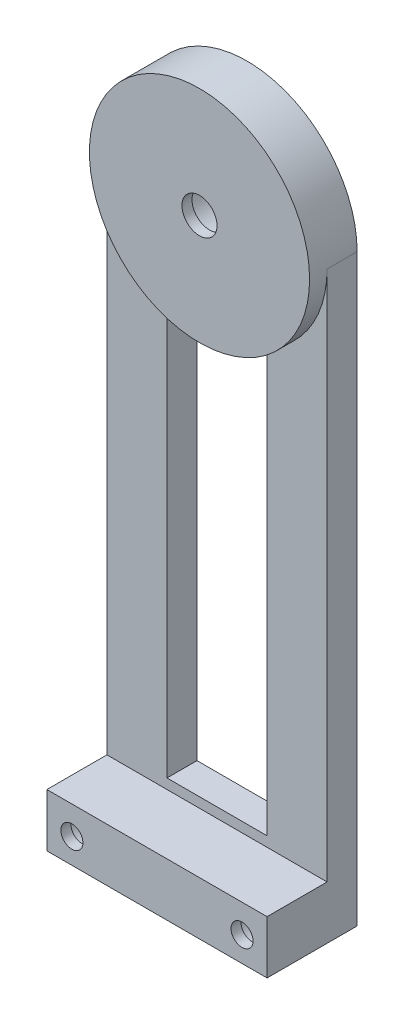
ISO-10303-21;
HEADER;
FILE_DESCRIPTION(('STEP AP214'),'2;1');
FILE_NAME('part.step','',(''),(''),'','','');
FILE_SCHEMA(('AUTOMOTIVE_DESIGN { 1 0 10303 214 1 1 1 1 }'));
ENDSEC;
DATA;
#1=APPLICATION_CONTEXT('core data for automotive mechanical design processes');
#2=APPLICATION_PROTOCOL_DEFINITION('international standard','automotive_design',2000,#1);
#3=PRODUCT_CONTEXT('',#1,'mechanical');
#4=PRODUCT('Part','Part','',(#3));
#5=PRODUCT_RELATED_PRODUCT_CATEGORY('part','',(#4));
#6=PRODUCT_DEFINITION_FORMATION('','',#4);
#7=PRODUCT_DEFINITION_CONTEXT('part definition',#1,'design');
#8=PRODUCT_DEFINITION('design','',#6,#7);
#9=PRODUCT_DEFINITION_SHAPE('','',#8);
#10=(LENGTH_UNIT() NAMED_UNIT(*) SI_UNIT(.MILLI.,.METRE.));
#11=(NAMED_UNIT(*) PLANE_ANGLE_UNIT() SI_UNIT($,.RADIAN.));
#12=(NAMED_UNIT(*) SI_UNIT($,.STERADIAN.) SOLID_ANGLE_UNIT());
#13=UNCERTAINTY_MEASURE_WITH_UNIT(LENGTH_MEASURE(1.E-05),#10,'distance_accuracy_value','');
#14=(GEOMETRIC_REPRESENTATION_CONTEXT(3) GLOBAL_UNCERTAINTY_ASSIGNED_CONTEXT((#13)) GLOBAL_UNIT_ASSIGNED_CONTEXT((#10,
#11,#12)) REPRESENTATION_CONTEXT('',''));
#15=CARTESIAN_POINT('',(0.,0.,0.));
#16=DIRECTION('',(0.,0.,1.));
#17=DIRECTION('',(1.,0.,0.));
#18=AXIS2_PLACEMENT_3D('',#15,#16,#17);
#19=CARTESIAN_POINT('',(8.5,-26.67999607,9.11126983722081));
#20=DIRECTION('',(0.,0.,-1.));
#21=DIRECTION('',(1.,0.,0.));
#22=AXIS2_PLACEMENT_3D('',#19,#20,#21);
#23=CYLINDRICAL_SURFACE('',#22,1.1);
#24=CARTESIAN_POINT('',(8.5,-26.67999607,6.));
#25=DIRECTION('',(0.,0.,1.));
#26=DIRECTION('',(1.,0.,0.));
#27=AXIS2_PLACEMENT_3D('',#24,#25,#26);
#28=CIRCLE('',#27,1.1);
#29=CARTESIAN_POINT('',(9.6,-26.67999607,6.));
#30=VERTEX_POINT('',#29);
#31=EDGE_CURVE('E256',#30,#30,#28,.F.);
#32=ORIENTED_EDGE('',*,*,#31,.F.);
#33=EDGE_LOOP('',(#32));
#34=FACE_BOUND('',#33,.T.);
#35=CARTESIAN_POINT('',(8.5,-26.67999607,5.));
#36=DIRECTION('',(0.,0.,1.));
#37=DIRECTION('',(1.,0.,0.));
#38=AXIS2_PLACEMENT_3D('',#35,#36,#37);
#39=CIRCLE('',#38,1.1);
#40=CARTESIAN_POINT('',(9.6,-26.67999607,5.));
#41=VERTEX_POINT('',#40);
#42=EDGE_CURVE('E262',#41,#41,#39,.F.);
#43=ORIENTED_EDGE('',*,*,#42,.T.);
#44=EDGE_LOOP('',(#43));
#45=FACE_BOUND('',#44,.T.);
#46=ADVANCED_FACE('F61',(#34,#45),#23,.F.);
#47=CARTESIAN_POINT('',(-8.5,-26.67999607,9.11126983722081));
#48=DIRECTION('',(0.,0.,-1.));
#49=DIRECTION('',(1.,0.,0.));
#50=AXIS2_PLACEMENT_3D('',#47,#48,#49);
#51=CYLINDRICAL_SURFACE('',#50,1.1);
#52=CARTESIAN_POINT('',(-8.5,-26.67999607,6.));
#53=DIRECTION('',(0.,0.,1.));
#54=DIRECTION('',(1.,0.,0.));
#55=AXIS2_PLACEMENT_3D('',#52,#53,#54);
#56=CIRCLE('',#55,1.1);
#57=CARTESIAN_POINT('',(-7.4,-26.67999607,6.));
#58=VERTEX_POINT('',#57);
#59=EDGE_CURVE('E208',#58,#58,#56,.F.);
#60=ORIENTED_EDGE('',*,*,#59,.F.);
#61=EDGE_LOOP('',(#60));
#62=FACE_BOUND('',#61,.T.);
#63=CARTESIAN_POINT('',(-8.5,-26.67999607,5.));
#64=DIRECTION('',(0.,0.,1.));
#65=DIRECTION('',(1.,0.,0.));
#66=AXIS2_PLACEMENT_3D('',#63,#64,#65);
#67=CIRCLE('',#66,1.1);
#68=CARTESIAN_POINT('',(-7.4,-26.67999607,5.));
#69=VERTEX_POINT('',#68);
#70=EDGE_CURVE('E259',#69,#69,#67,.F.);
#71=ORIENTED_EDGE('',*,*,#70,.T.);
#72=EDGE_LOOP('',(#71));
#73=FACE_BOUND('',#72,.T.);
#74=ADVANCED_FACE('F314',(#62,#73),#51,.F.);
#75=CARTESIAN_POINT('',(0.,0.,0.));
#76=DIRECTION('',(0.,0.,-1.));
#77=DIRECTION('',(1.,0.,0.));
#78=AXIS2_PLACEMENT_3D('',#75,#76,#77);
#79=PLANE('',#78);
#80=CARTESIAN_POINT('',(0.,29.175,0.));
#81=DIRECTION('',(0.,0.,1.));
#82=DIRECTION('',(1.,0.,0.));
#83=AXIS2_PLACEMENT_3D('',#80,#81,#82);
#84=CIRCLE('',#83,11.5);
#85=CARTESIAN_POINT('',(-5.,18.818842411396,0.));
#86=VERTEX_POINT('',#85);
#87=CARTESIAN_POINT('',(5.,18.818842411396,0.));
#88=VERTEX_POINT('',#87);
#89=EDGE_CURVE('E158',#86,#88,#84,.T.);
#90=ORIENTED_EDGE('',*,*,#89,.T.);
#91=DIRECTION('',(0.,-1.,0.));
#92=VECTOR('',#91,1.);
#93=CARTESIAN_POINT('',(5.,0.,0.));
#94=LINE('',#93,#92);
#95=CARTESIAN_POINT('',(5.00000000000001,-22.865,0.));
#96=VERTEX_POINT('',#95);
#97=EDGE_CURVE('E176',#88,#96,#94,.T.);
#98=ORIENTED_EDGE('',*,*,#97,.T.);
#99=DIRECTION('',(1.,0.,0.));
#100=VECTOR('',#99,1.);
#101=CARTESIAN_POINT('',(0.,-22.865,0.));
#102=LINE('',#101,#100);
#103=CARTESIAN_POINT('',(-5.,-22.865,0.));
#104=VERTEX_POINT('',#103);
#105=EDGE_CURVE('E230',#104,#96,#102,.T.);
#106=ORIENTED_EDGE('',*,*,#105,.F.);
#107=DIRECTION('',(0.,-1.,0.));
#108=VECTOR('',#107,1.);
#109=CARTESIAN_POINT('',(-5.,0.,0.));
#110=LINE('',#109,#108);
#111=EDGE_CURVE('E233',#86,#104,#110,.T.);
#112=ORIENTED_EDGE('',*,*,#111,.F.);
#113=EDGE_LOOP('',(#90,#98,#106,#112));
#114=FACE_BOUND('',#113,.T.);
#115=DIRECTION('',(1.,0.,0.));
#116=VECTOR('',#115,1.);
#117=CARTESIAN_POINT('',(0.,-23.865,0.));
#118=LINE('',#117,#116);
#119=CARTESIAN_POINT('',(-11.,-23.865,0.));
#120=VERTEX_POINT('',#119);
#121=CARTESIAN_POINT('',(11.,-23.865,0.));
#122=VERTEX_POINT('',#121);
#123=EDGE_CURVE('E204',#120,#122,#118,.T.);
#124=ORIENTED_EDGE('',*,*,#123,.T.);
#125=DIRECTION('',(0.,-1.,0.));
#126=VECTOR('',#125,1.);
#127=CARTESIAN_POINT('',(11.,0.,0.));
#128=LINE('',#127,#126);
#129=CARTESIAN_POINT('',(11.,29.175,0.));
#130=VERTEX_POINT('',#129);
#131=EDGE_CURVE('E235',#130,#122,#128,.T.);
#132=ORIENTED_EDGE('',*,*,#131,.F.);
#133=CARTESIAN_POINT('',(0.,29.175,0.));
#134=DIRECTION('',(0.,0.,1.));
#135=DIRECTION('',(1.,0.,0.));
#136=AXIS2_PLACEMENT_3D('',#133,#134,#135);
#137=CIRCLE('',#136,11.);
#138=CARTESIAN_POINT('',(-11.,29.175,0.));
#139=VERTEX_POINT('',#138);
#140=EDGE_CURVE('E13',#139,#130,#137,.T.);
#141=ORIENTED_EDGE('',*,*,#140,.F.);
#142=DIRECTION('',(0.,-1.,0.));
#143=VECTOR('',#142,1.);
#144=CARTESIAN_POINT('',(-11.,0.,0.));
#145=LINE('',#144,#143);
#146=EDGE_CURVE('E153',#139,#120,#145,.T.);
#147=ORIENTED_EDGE('',*,*,#146,.T.);
#148=EDGE_LOOP('',(#124,#132,#141,#147));
#149=FACE_BOUND('',#148,.T.);
#150=ADVANCED_FACE('F244',(#114,#149),#79,.F.);
#151=CARTESIAN_POINT('',(0.,29.175,6.69974746830584));
#152=DIRECTION('',(0.,0.,-1.));
#153=DIRECTION('',(1.,0.,0.));
#154=AXIS2_PLACEMENT_3D('',#151,#152,#153);
#155=CYLINDRICAL_SURFACE('',#154,1.75);
#156=CARTESIAN_POINT('',(0.,29.175,1.75));
#157=DIRECTION('',(0.,0.,1.));
#158=DIRECTION('',(1.,0.,0.));
#159=AXIS2_PLACEMENT_3D('',#156,#157,#158);
#160=CIRCLE('',#159,1.75);
#161=CARTESIAN_POINT('',(1.75,29.175,1.75));
#162=VERTEX_POINT('',#161);
#163=EDGE_CURVE('E219',#162,#162,#160,.F.);
#164=ORIENTED_EDGE('',*,*,#163,.F.);
#165=EDGE_LOOP('',(#164));
#166=FACE_BOUND('',#165,.T.);
#167=CARTESIAN_POINT('',(0.,29.175,0.750000000000001));
#168=DIRECTION('',(0.,0.,1.));
#169=DIRECTION('',(1.,0.,0.));
#170=AXIS2_PLACEMENT_3D('',#167,#168,#169);
#171=CIRCLE('',#170,1.75);
#172=CARTESIAN_POINT('',(1.75,29.175,0.750000000000001));
#173=VERTEX_POINT('',#172);
#174=EDGE_CURVE('E209',#173,#173,#171,.F.);
#175=ORIENTED_EDGE('',*,*,#174,.T.);
#176=EDGE_LOOP('',(#175));
#177=FACE_BOUND('',#176,.T.);
#178=ADVANCED_FACE('F401',(#166,#177),#155,.F.);
#179=CARTESIAN_POINT('',(11.,0.,-3.));
#180=DIRECTION('',(1.,0.,0.));
#181=DIRECTION('',(0.,0.,1.));
#182=AXIS2_PLACEMENT_3D('',#179,#180,#181);
#183=PLANE('',#182);
#184=ORIENTED_EDGE('',*,*,#131,.T.);
#185=DIRECTION('',(0.,0.,-1.));
#186=VECTOR('',#185,1.);
#187=CARTESIAN_POINT('',(11.,-23.865,6.));
#188=LINE('',#187,#186);
#189=CARTESIAN_POINT('',(11.,-23.865,6.));
#190=VERTEX_POINT('',#189);
#191=EDGE_CURVE('E193',#190,#122,#188,.T.);
#192=ORIENTED_EDGE('',*,*,#191,.F.);
#193=DIRECTION('',(0.,-1.,0.));
#194=VECTOR('',#193,1.);
#195=CARTESIAN_POINT('',(11.,0.,6.));
#196=LINE('',#195,#194);
#197=CARTESIAN_POINT('',(11.,-29.175,6.));
#198=VERTEX_POINT('',#197);
#199=EDGE_CURVE('E189',#190,#198,#196,.T.);
#200=ORIENTED_EDGE('',*,*,#199,.T.);
#201=DIRECTION('',(0.,0.,1.));
#202=VECTOR('',#201,1.);
#203=CARTESIAN_POINT('',(11.,-29.175,-3.));
#204=LINE('',#203,#202);
#205=CARTESIAN_POINT('',(11.,-29.175,-3.));
#206=VERTEX_POINT('',#205);
#207=EDGE_CURVE('E65',#206,#198,#204,.T.);
#208=ORIENTED_EDGE('',*,*,#207,.F.);
#209=DIRECTION('',(0.,-1.,0.));
#210=VECTOR('',#209,1.);
#211=CARTESIAN_POINT('',(11.,0.,-3.));
#212=LINE('',#211,#210);
#213=CARTESIAN_POINT('',(11.,29.175,-3.));
#214=VERTEX_POINT('',#213);
#215=EDGE_CURVE('E143',#214,#206,#212,.T.);
#216=ORIENTED_EDGE('',*,*,#215,.F.);
#217=DIRECTION('',(0.,0.,1.));
#218=VECTOR('',#217,1.);
#219=CARTESIAN_POINT('',(11.,29.175,-3.));
#220=LINE('',#219,#218);
#221=EDGE_CURVE('E71',#214,#130,#220,.T.);
#222=ORIENTED_EDGE('',*,*,#221,.T.);
#223=EDGE_LOOP('',(#184,#192,#200,#208,#216,#222));
#224=FACE_BOUND('',#223,.T.);
#225=ADVANCED_FACE('F191',(#224),#183,.T.);
#226=CARTESIAN_POINT('',(0.,29.175,-3.));
#227=DIRECTION('',(0.,0.,1.));
#228=DIRECTION('',(-1.,0.,0.));
#229=AXIS2_PLACEMENT_3D('',#226,#227,#228);
#230=CYLINDRICAL_SURFACE('',#229,11.);
#231=ORIENTED_EDGE('',*,*,#221,.F.);
#232=CARTESIAN_POINT('',(0.,29.175,-3.));
#233=DIRECTION('',(0.,0.,1.));
#234=DIRECTION('',(1.,0.,0.));
#235=AXIS2_PLACEMENT_3D('',#232,#233,#234);
#236=CIRCLE('',#235,11.);
#237=CARTESIAN_POINT('',(-11.,29.175,-3.));
#238=VERTEX_POINT('',#237);
#239=EDGE_CURVE('E162',#214,#238,#236,.T.);
#240=ORIENTED_EDGE('',*,*,#239,.T.);
#241=DIRECTION('',(0.,0.,1.));
#242=VECTOR('',#241,1.);
#243=CARTESIAN_POINT('',(-11.,29.175,-3.));
#244=LINE('',#243,#242);
#245=EDGE_CURVE('E114',#238,#139,#244,.T.);
#246=ORIENTED_EDGE('',*,*,#245,.T.);
#247=ORIENTED_EDGE('',*,*,#140,.T.);
#248=EDGE_LOOP('',(#231,#240,#246,#247));
#249=FACE_BOUND('',#248,.T.);
#250=CARTESIAN_POINT('',(0.,29.175,1.75));
#251=DIRECTION('',(0.,0.,1.));
#252=DIRECTION('',(1.,0.,0.));
#253=AXIS2_PLACEMENT_3D('',#250,#251,#252);
#254=CIRCLE('',#253,11.);
#255=CARTESIAN_POINT('',(11.,29.175,1.75));
#256=VERTEX_POINT('',#255);
#257=EDGE_CURVE('E170',#256,#256,#254,.T.);
#258=ORIENTED_EDGE('',*,*,#257,.F.);
#259=EDGE_LOOP('',(#258));
#260=FACE_BOUND('',#259,.T.);
#261=ADVANCED_FACE('F241',(#249,#260),#230,.T.);
#262=CARTESIAN_POINT('',(0.,29.175,-3.));
#263=DIRECTION('',(0.,0.,1.));
#264=DIRECTION('',(-1.,0.,0.));
#265=AXIS2_PLACEMENT_3D('',#262,#263,#264);
#266=CYLINDRICAL_SURFACE('',#265,11.5);
#267=ORIENTED_EDGE('',*,*,#89,.F.);
#268=DIRECTION('',(0.,0.,1.));
#269=VECTOR('',#268,1.);
#270=CARTESIAN_POINT('',(-5.,18.818842411396,-3.));
#271=LINE('',#270,#269);
#272=CARTESIAN_POINT('',(-5.,18.818842411396,-3.));
#273=VERTEX_POINT('',#272);
#274=EDGE_CURVE('E138',#273,#86,#271,.T.);
#275=ORIENTED_EDGE('',*,*,#274,.F.);
#276=CARTESIAN_POINT('',(0.,29.175,-3.));
#277=DIRECTION('',(0.,0.,1.));
#278=DIRECTION('',(1.,0.,0.));
#279=AXIS2_PLACEMENT_3D('',#276,#277,#278);
#280=CIRCLE('',#279,11.5);
#281=CARTESIAN_POINT('',(5.,18.818842411396,-3.));
#282=VERTEX_POINT('',#281);
#283=EDGE_CURVE('E147',#273,#282,#280,.T.);
#284=ORIENTED_EDGE('',*,*,#283,.T.);
#285=DIRECTION('',(0.,0.,1.));
#286=VECTOR('',#285,1.);
#287=CARTESIAN_POINT('',(5.,18.818842411396,-3.));
#288=LINE('',#287,#286);
#289=EDGE_CURVE('E168',#282,#88,#288,.T.);
#290=ORIENTED_EDGE('',*,*,#289,.T.);
#291=EDGE_LOOP('',(#267,#275,#284,#290));
#292=FACE_BOUND('',#291,.T.);
#293=ADVANCED_FACE('F156',(#292),#266,.T.);
#294=CARTESIAN_POINT('',(5.,0.,-3.));
#295=DIRECTION('',(1.,0.,0.));
#296=DIRECTION('',(0.,1.,0.));
#297=AXIS2_PLACEMENT_3D('',#294,#295,#296);
#298=PLANE('',#297);
#299=ORIENTED_EDGE('',*,*,#97,.F.);
#300=ORIENTED_EDGE('',*,*,#289,.F.);
#301=DIRECTION('',(0.,-1.,0.));
#302=VECTOR('',#301,1.);
#303=CARTESIAN_POINT('',(5.,0.,-3.));
#304=LINE('',#303,#302);
#305=CARTESIAN_POINT('',(5.00000000000001,-22.865,-3.));
#306=VERTEX_POINT('',#305);
#307=EDGE_CURVE('E150',#282,#306,#304,.T.);
#308=ORIENTED_EDGE('',*,*,#307,.T.);
#309=DIRECTION('',(0.,0.,1.));
#310=VECTOR('',#309,1.);
#311=CARTESIAN_POINT('',(5.00000000000001,-22.865,-3.));
#312=LINE('',#311,#310);
#313=EDGE_CURVE('E160',#306,#96,#312,.T.);
#314=ORIENTED_EDGE('',*,*,#313,.T.);
#315=EDGE_LOOP('',(#299,#300,#308,#314));
#316=FACE_BOUND('',#315,.T.);
#317=ADVANCED_FACE('F440',(#316),#298,.F.);
#318=CARTESIAN_POINT('',(0.,-22.865,-3.));
#319=DIRECTION('',(0.,1.,0.));
#320=DIRECTION('',(0.,0.,-1.));
#321=AXIS2_PLACEMENT_3D('',#318,#319,#320);
#322=PLANE('',#321);
#323=ORIENTED_EDGE('',*,*,#105,.T.);
#324=ORIENTED_EDGE('',*,*,#313,.F.);
#325=DIRECTION('',(1.,0.,0.));
#326=VECTOR('',#325,1.);
#327=CARTESIAN_POINT('',(0.,-22.865,-3.));
#328=LINE('',#327,#326);
#329=CARTESIAN_POINT('',(-5.,-22.865,-3.));
#330=VERTEX_POINT('',#329);
#331=EDGE_CURVE('E144',#330,#306,#328,.T.);
#332=ORIENTED_EDGE('',*,*,#331,.F.);
#333=DIRECTION('',(0.,0.,1.));
#334=VECTOR('',#333,1.);
#335=CARTESIAN_POINT('',(-5.,-22.865,-3.));
#336=LINE('',#335,#334);
#337=EDGE_CURVE('E140',#330,#104,#336,.T.);
#338=ORIENTED_EDGE('',*,*,#337,.T.);
#339=EDGE_LOOP('',(#323,#324,#332,#338));
#340=FACE_BOUND('',#339,.T.);
#341=ADVANCED_FACE('F448',(#340),#322,.T.);
#342=CARTESIAN_POINT('',(-5.,0.,-3.));
#343=DIRECTION('',(1.,0.,0.));
#344=DIRECTION('',(0.,1.,0.));
#345=AXIS2_PLACEMENT_3D('',#342,#343,#344);
#346=PLANE('',#345);
#347=ORIENTED_EDGE('',*,*,#111,.T.);
#348=ORIENTED_EDGE('',*,*,#337,.F.);
#349=DIRECTION('',(0.,-1.,0.));
#350=VECTOR('',#349,1.);
#351=CARTESIAN_POINT('',(-5.,0.,-3.));
#352=LINE('',#351,#350);
#353=EDGE_CURVE('E133',#273,#330,#352,.T.);
#354=ORIENTED_EDGE('',*,*,#353,.F.);
#355=ORIENTED_EDGE('',*,*,#274,.T.);
#356=EDGE_LOOP('',(#347,#348,#354,#355));
#357=FACE_BOUND('',#356,.T.);
#358=ADVANCED_FACE('F136',(#357),#346,.T.);
#359=CARTESIAN_POINT('',(-11.,0.,-3.));
#360=DIRECTION('',(1.,0.,0.));
#361=DIRECTION('',(0.,0.,1.));
#362=AXIS2_PLACEMENT_3D('',#359,#360,#361);
#363=PLANE('',#362);
#364=ORIENTED_EDGE('',*,*,#146,.F.);
#365=ORIENTED_EDGE('',*,*,#245,.F.);
#366=DIRECTION('',(0.,-1.,0.));
#367=VECTOR('',#366,1.);
#368=CARTESIAN_POINT('',(-11.,0.,-3.));
#369=LINE('',#368,#367);
#370=CARTESIAN_POINT('',(-11.,-29.175,-3.));
#371=VERTEX_POINT('',#370);
#372=EDGE_CURVE('E80',#238,#371,#369,.T.);
#373=ORIENTED_EDGE('',*,*,#372,.T.);
#374=DIRECTION('',(0.,0.,1.));
#375=VECTOR('',#374,1.);
#376=CARTESIAN_POINT('',(-11.,-29.175,-3.));
#377=LINE('',#376,#375);
#378=CARTESIAN_POINT('',(-11.,-29.175,6.));
#379=VERTEX_POINT('',#378);
#380=EDGE_CURVE('E171',#371,#379,#377,.T.);
#381=ORIENTED_EDGE('',*,*,#380,.T.);
#382=DIRECTION('',(0.,-1.,0.));
#383=VECTOR('',#382,1.);
#384=CARTESIAN_POINT('',(-11.,0.,6.));
#385=LINE('',#384,#383);
#386=CARTESIAN_POINT('',(-11.,-23.865,6.));
#387=VERTEX_POINT('',#386);
#388=EDGE_CURVE('E200',#387,#379,#385,.T.);
#389=ORIENTED_EDGE('',*,*,#388,.F.);
#390=DIRECTION('',(0.,0.,-1.));
#391=VECTOR('',#390,1.);
#392=CARTESIAN_POINT('',(-11.,-23.865,6.));
#393=LINE('',#392,#391);
#394=EDGE_CURVE('E196',#387,#120,#393,.T.);
#395=ORIENTED_EDGE('',*,*,#394,.T.);
#396=EDGE_LOOP('',(#364,#365,#373,#381,#389,#395));
#397=FACE_BOUND('',#396,.T.);
#398=ADVANCED_FACE('F291',(#397),#363,.F.);
#399=CARTESIAN_POINT('',(0.,0.,-3.));
#400=DIRECTION('',(0.,0.,-1.));
#401=DIRECTION('',(1.,0.,0.));
#402=AXIS2_PLACEMENT_3D('',#399,#400,#401);
#403=PLANE('',#402);
#404=CARTESIAN_POINT('',(-8.5,-26.67999607,-3.));
#405=DIRECTION('',(0.,0.,1.));
#406=DIRECTION('',(1.,0.,0.));
#407=AXIS2_PLACEMENT_3D('',#404,#405,#406);
#408=CIRCLE('',#407,2.);
#409=CARTESIAN_POINT('',(-6.5,-26.67999607,-3.));
#410=VERTEX_POINT('',#409);
#411=EDGE_CURVE('E265',#410,#410,#408,.T.);
#412=ORIENTED_EDGE('',*,*,#411,.T.);
#413=EDGE_LOOP('',(#412));
#414=FACE_BOUND('',#413,.T.);
#415=CARTESIAN_POINT('',(8.5,-26.67999607,-3.));
#416=DIRECTION('',(0.,0.,1.));
#417=DIRECTION('',(1.,0.,0.));
#418=AXIS2_PLACEMENT_3D('',#415,#416,#417);
#419=CIRCLE('',#418,2.);
#420=CARTESIAN_POINT('',(10.5,-26.67999607,-3.));
#421=VERTEX_POINT('',#420);
#422=EDGE_CURVE('E267',#421,#421,#419,.T.);
#423=ORIENTED_EDGE('',*,*,#422,.T.);
#424=EDGE_LOOP('',(#423));
#425=FACE_BOUND('',#424,.T.);
#426=CARTESIAN_POINT('',(0.,29.175,-3.));
#427=DIRECTION('',(0.,0.,1.));
#428=DIRECTION('',(1.,0.,0.));
#429=AXIS2_PLACEMENT_3D('',#426,#427,#428);
#430=CIRCLE('',#429,3.);
#431=CARTESIAN_POINT('',(3.,29.175,-3.));
#432=VERTEX_POINT('',#431);
#433=EDGE_CURVE('E211',#432,#432,#430,.T.);
#434=ORIENTED_EDGE('',*,*,#433,.T.);
#435=EDGE_LOOP('',(#434));
#436=FACE_BOUND('',#435,.T.);
#437=ORIENTED_EDGE('',*,*,#283,.F.);
#438=ORIENTED_EDGE('',*,*,#353,.T.);
#439=ORIENTED_EDGE('',*,*,#331,.T.);
#440=ORIENTED_EDGE('',*,*,#307,.F.);
#441=EDGE_LOOP('',(#437,#438,#439,#440));
#442=FACE_BOUND('',#441,.T.);
#443=ORIENTED_EDGE('',*,*,#372,.F.);
#444=ORIENTED_EDGE('',*,*,#239,.F.);
#445=ORIENTED_EDGE('',*,*,#215,.T.);
#446=DIRECTION('',(1.,0.,0.));
#447=VECTOR('',#446,1.);
#448=CARTESIAN_POINT('',(-11.,-29.175,-3.));
#449=LINE('',#448,#447);
#450=EDGE_CURVE('E107',#371,#206,#449,.T.);
#451=ORIENTED_EDGE('',*,*,#450,.F.);
#452=EDGE_LOOP('',(#443,#444,#445,#451));
#453=FACE_BOUND('',#452,.T.);
#454=ADVANCED_FACE('F148',(#414,#425,#436,#442,#453),#403,.T.);
#455=CARTESIAN_POINT('',(-11.,-29.175,-3.));
#456=DIRECTION('',(0.,1.,0.));
#457=DIRECTION('',(0.,0.,-1.));
#458=AXIS2_PLACEMENT_3D('',#455,#456,#457);
#459=PLANE('',#458);
#460=ORIENTED_EDGE('',*,*,#380,.F.);
#461=ORIENTED_EDGE('',*,*,#450,.T.);
#462=ORIENTED_EDGE('',*,*,#207,.T.);
#463=DIRECTION('',(1.,0.,0.));
#464=VECTOR('',#463,1.);
#465=CARTESIAN_POINT('',(0.,-29.175,6.));
#466=LINE('',#465,#464);
#467=EDGE_CURVE('E182',#379,#198,#466,.T.);
#468=ORIENTED_EDGE('',*,*,#467,.F.);
#469=EDGE_LOOP('',(#460,#461,#462,#468));
#470=FACE_BOUND('',#469,.T.);
#471=ADVANCED_FACE('F63',(#470),#459,.F.);
#472=CARTESIAN_POINT('',(0.,0.,1.75));
#473=DIRECTION('',(0.,0.,-1.));
#474=DIRECTION('',(1.,0.,0.));
#475=AXIS2_PLACEMENT_3D('',#472,#473,#474);
#476=PLANE('',#475);
#477=ORIENTED_EDGE('',*,*,#163,.T.);
#478=EDGE_LOOP('',(#477));
#479=FACE_BOUND('',#478,.T.);
#480=ORIENTED_EDGE('',*,*,#257,.T.);
#481=EDGE_LOOP('',(#480));
#482=FACE_BOUND('',#481,.T.);
#483=ADVANCED_FACE('F300',(#479,#482),#476,.F.);
#484=CARTESIAN_POINT('',(0.,29.175,10.2352813742386));
#485=DIRECTION('',(0.,0.,-1.));
#486=DIRECTION('',(1.,0.,0.));
#487=AXIS2_PLACEMENT_3D('',#484,#485,#486);
#488=CYLINDRICAL_SURFACE('',#487,3.);
#489=CARTESIAN_POINT('',(0.,29.175,0.750000000000001));
#490=DIRECTION('',(0.,0.,1.));
#491=DIRECTION('',(1.,0.,0.));
#492=AXIS2_PLACEMENT_3D('',#489,#490,#491);
#493=CIRCLE('',#492,3.);
#494=CARTESIAN_POINT('',(3.,29.175,0.750000000000001));
#495=VERTEX_POINT('',#494);
#496=EDGE_CURVE('E214',#495,#495,#493,.F.);
#497=ORIENTED_EDGE('',*,*,#496,.F.);
#498=EDGE_LOOP('',(#497));
#499=FACE_BOUND('',#498,.T.);
#500=ORIENTED_EDGE('',*,*,#433,.F.);
#501=EDGE_LOOP('',(#500));
#502=FACE_BOUND('',#501,.T.);
#503=ADVANCED_FACE('F297',(#499,#502),#488,.F.);
#504=CARTESIAN_POINT('',(0.,0.,0.75));
#505=DIRECTION('',(0.,0.,-1.));
#506=DIRECTION('',(1.,0.,0.));
#507=AXIS2_PLACEMENT_3D('',#504,#505,#506);
#508=PLANE('',#507);
#509=ORIENTED_EDGE('',*,*,#496,.T.);
#510=EDGE_LOOP('',(#509));
#511=FACE_BOUND('',#510,.T.);
#512=ORIENTED_EDGE('',*,*,#174,.F.);
#513=EDGE_LOOP('',(#512));
#514=FACE_BOUND('',#513,.T.);
#515=ADVANCED_FACE('F299',(#511,#514),#508,.T.);
#516=CARTESIAN_POINT('',(0.,-23.865,6.));
#517=DIRECTION('',(0.,-1.,0.));
#518=DIRECTION('',(0.,0.,1.));
#519=AXIS2_PLACEMENT_3D('',#516,#517,#518);
#520=PLANE('',#519);
#521=ORIENTED_EDGE('',*,*,#123,.F.);
#522=ORIENTED_EDGE('',*,*,#394,.F.);
#523=DIRECTION('',(1.,0.,0.));
#524=VECTOR('',#523,1.);
#525=CARTESIAN_POINT('',(0.,-23.865,6.));
#526=LINE('',#525,#524);
#527=EDGE_CURVE('E207',#387,#190,#526,.T.);
#528=ORIENTED_EDGE('',*,*,#527,.T.);
#529=ORIENTED_EDGE('',*,*,#191,.T.);
#530=EDGE_LOOP('',(#521,#522,#528,#529));
#531=FACE_BOUND('',#530,.T.);
#532=ADVANCED_FACE('F250',(#531),#520,.F.);
#533=CARTESIAN_POINT('',(0.,0.,6.));
#534=DIRECTION('',(0.,0.,-1.));
#535=DIRECTION('',(1.,0.,0.));
#536=AXIS2_PLACEMENT_3D('',#533,#534,#535);
#537=PLANE('',#536);
#538=ORIENTED_EDGE('',*,*,#59,.T.);
#539=EDGE_LOOP('',(#538));
#540=FACE_BOUND('',#539,.T.);
#541=ORIENTED_EDGE('',*,*,#31,.T.);
#542=EDGE_LOOP('',(#541));
#543=FACE_BOUND('',#542,.T.);
#544=ORIENTED_EDGE('',*,*,#527,.F.);
#545=ORIENTED_EDGE('',*,*,#388,.T.);
#546=ORIENTED_EDGE('',*,*,#467,.T.);
#547=ORIENTED_EDGE('',*,*,#199,.F.);
#548=EDGE_LOOP('',(#544,#545,#546,#547));
#549=FACE_BOUND('',#548,.T.);
#550=ADVANCED_FACE('F253',(#540,#543,#549),#537,.F.);
#551=CARTESIAN_POINT('',(-8.5,-26.67999607,11.6568542494924));
#552=DIRECTION('',(0.,0.,-1.));
#553=DIRECTION('',(1.,0.,0.));
#554=AXIS2_PLACEMENT_3D('',#551,#552,#553);
#555=CYLINDRICAL_SURFACE('',#554,2.);
#556=CARTESIAN_POINT('',(-8.5,-26.67999607,5.));
#557=DIRECTION('',(0.,0.,1.));
#558=DIRECTION('',(1.,0.,0.));
#559=AXIS2_PLACEMENT_3D('',#556,#557,#558);
#560=CIRCLE('',#559,2.);
#561=CARTESIAN_POINT('',(-6.5,-26.67999607,5.));
#562=VERTEX_POINT('',#561);
#563=EDGE_CURVE('E274',#562,#562,#560,.F.);
#564=ORIENTED_EDGE('',*,*,#563,.F.);
#565=EDGE_LOOP('',(#564));
#566=FACE_BOUND('',#565,.T.);
#567=ORIENTED_EDGE('',*,*,#411,.F.);
#568=EDGE_LOOP('',(#567));
#569=FACE_BOUND('',#568,.T.);
#570=ADVANCED_FACE('F283',(#566,#569),#555,.F.);
#571=CARTESIAN_POINT('',(0.,0.,5.));
#572=DIRECTION('',(0.,0.,-1.));
#573=DIRECTION('',(1.,0.,0.));
#574=AXIS2_PLACEMENT_3D('',#571,#572,#573);
#575=PLANE('',#574);
#576=ORIENTED_EDGE('',*,*,#563,.T.);
#577=EDGE_LOOP('',(#576));
#578=FACE_BOUND('',#577,.T.);
#579=ORIENTED_EDGE('',*,*,#70,.F.);
#580=EDGE_LOOP('',(#579));
#581=FACE_BOUND('',#580,.T.);
#582=ADVANCED_FACE('F280',(#578,#581),#575,.T.);
#583=CARTESIAN_POINT('',(8.5,-26.67999607,11.6568542494924));
#584=DIRECTION('',(0.,0.,-1.));
#585=DIRECTION('',(1.,0.,0.));
#586=AXIS2_PLACEMENT_3D('',#583,#584,#585);
#587=CYLINDRICAL_SURFACE('',#586,2.);
#588=CARTESIAN_POINT('',(8.5,-26.67999607,5.));
#589=DIRECTION('',(0.,0.,1.));
#590=DIRECTION('',(1.,0.,0.));
#591=AXIS2_PLACEMENT_3D('',#588,#589,#590);
#592=CIRCLE('',#591,2.);
#593=CARTESIAN_POINT('',(10.5,-26.67999607,5.));
#594=VERTEX_POINT('',#593);
#595=EDGE_CURVE('E266',#594,#594,#592,.F.);
#596=ORIENTED_EDGE('',*,*,#595,.F.);
#597=EDGE_LOOP('',(#596));
#598=FACE_BOUND('',#597,.T.);
#599=ORIENTED_EDGE('',*,*,#422,.F.);
#600=EDGE_LOOP('',(#599));
#601=FACE_BOUND('',#600,.T.);
#602=ADVANCED_FACE('F347',(#598,#601),#587,.F.);
#603=CARTESIAN_POINT('',(0.,0.,5.));
#604=DIRECTION('',(0.,0.,-1.));
#605=DIRECTION('',(1.,0.,0.));
#606=AXIS2_PLACEMENT_3D('',#603,#604,#605);
#607=PLANE('',#606);
#608=ORIENTED_EDGE('',*,*,#595,.T.);
#609=EDGE_LOOP('',(#608));
#610=FACE_BOUND('',#609,.T.);
#611=ORIENTED_EDGE('',*,*,#42,.F.);
#612=EDGE_LOOP('',(#611));
#613=FACE_BOUND('',#612,.T.);
#614=ADVANCED_FACE('F354',(#610,#613),#607,.T.);
#615=CLOSED_SHELL('',(#46,#74,#150,#178,#225,#261,#293,#317,#341,#358,#398,#454,#471,#483,#503,
#515,#532,#550,#570,#582,#602,#614));
#616=MANIFOLD_SOLID_BREP('B2',#615);
#617=ADVANCED_BREP_SHAPE_REPRESENTATION('',(#18,#616),#14);
#618=SHAPE_DEFINITION_REPRESENTATION(#9,#617);
ENDSEC;
END-ISO-10303-21;
